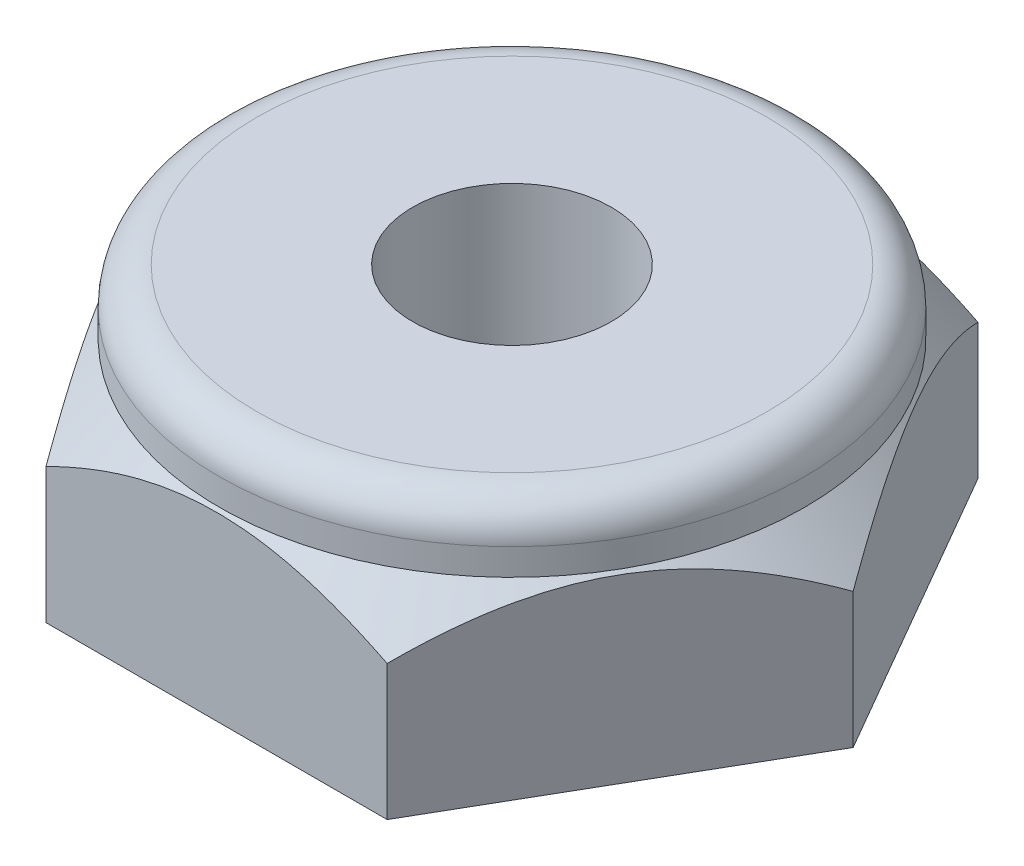
ISO-10303-21;
HEADER;
FILE_DESCRIPTION(('STEP AP214'),'2;1');
FILE_NAME('part.step','',(''),(''),'','','');
FILE_SCHEMA(('AUTOMOTIVE_DESIGN { 1 0 10303 214 1 1 1 1 }'));
ENDSEC;
DATA;
#1=APPLICATION_CONTEXT('core data for automotive mechanical design processes');
#2=APPLICATION_PROTOCOL_DEFINITION('international standard','automotive_design',2000,#1);
#3=PRODUCT_CONTEXT('',#1,'mechanical');
#4=PRODUCT('Part','Part','',(#3));
#5=PRODUCT_RELATED_PRODUCT_CATEGORY('part','',(#4));
#6=PRODUCT_DEFINITION_FORMATION('','',#4);
#7=PRODUCT_DEFINITION_CONTEXT('part definition',#1,'design');
#8=PRODUCT_DEFINITION('design','',#6,#7);
#9=PRODUCT_DEFINITION_SHAPE('','',#8);
#10=(LENGTH_UNIT() NAMED_UNIT(*) SI_UNIT(.MILLI.,.METRE.));
#11=(NAMED_UNIT(*) PLANE_ANGLE_UNIT() SI_UNIT($,.RADIAN.));
#12=(NAMED_UNIT(*) SI_UNIT($,.STERADIAN.) SOLID_ANGLE_UNIT());
#13=UNCERTAINTY_MEASURE_WITH_UNIT(LENGTH_MEASURE(1.E-05),#10,'distance_accuracy_value','');
#14=(GEOMETRIC_REPRESENTATION_CONTEXT(3) GLOBAL_UNCERTAINTY_ASSIGNED_CONTEXT((#13)) GLOBAL_UNIT_ASSIGNED_CONTEXT((#10,
#11,#12)) REPRESENTATION_CONTEXT('',''));
#15=CARTESIAN_POINT('',(0.,0.,0.));
#16=DIRECTION('',(0.,0.,1.));
#17=DIRECTION('',(1.,0.,0.));
#18=AXIS2_PLACEMENT_3D('',#15,#16,#17);
#19=CARTESIAN_POINT('',(-4.54605601959911,-3.302,0.));
#20=DIRECTION('',(-0.866025403784439,0.,0.5));
#21=DIRECTION('',(0.5,0.,0.866025403784439));
#22=AXIS2_PLACEMENT_3D('',#19,#20,#21);
#23=PLANE('',#22);
#24=CARTESIAN_POINT('',(-4.54617148965295,-1.50011547445315,-0.000199999999996562));
#25=CARTESIAN_POINT('',(-4.50708615861735,-1.46103413357023,0.0674977791843119));
#26=CARTESIAN_POINT('',(-4.46770173308911,-1.42315178723117,0.135713605226132));
#27=CARTESIAN_POINT('',(-4.38827308186812,-1.35015056154902,0.273288064717551));
#28=CARTESIAN_POINT('',(-4.34822851003329,-1.31503319158854,0.342647297702827));
#29=CARTESIAN_POINT('',(-4.2266400726266,-1.21407726664643,0.553244648904112));
#30=CARTESIAN_POINT('',(-4.1440628260123,-1.15306563669066,0.696272635589224));
#31=CARTESIAN_POINT('',(-3.97757147931389,-1.04858005372606,0.98464410709144));
#32=CARTESIAN_POINT('',(-3.89369943400899,-1.00484298136551,1.12991475089425));
#33=CARTESIAN_POINT('',(-3.72410331475854,-0.93745108995119,1.42366384620255));
#34=CARTESIAN_POINT('',(-3.63838443490816,-0.913745990599986,1.57213330127129));
#35=CARTESIAN_POINT('',(-3.49065141864676,-0.892358407810814,1.82801439139144));
#36=CARTESIAN_POINT('',(-3.42882762170213,-0.889193072578656,1.93509634881635));
#37=CARTESIAN_POINT('',(-3.30528037085692,-0.894528794508116,2.14908646441571));
#38=CARTESIAN_POINT('',(-3.2435569597247,-0.903033941378471,2.25599454851318));
#39=CARTESIAN_POINT('',(-3.12069497858448,-0.931225501079716,2.46879774216662));
#40=CARTESIAN_POINT('',(-3.05955714058954,-0.950924419546993,2.57469158383876));
#41=CARTESIAN_POINT('',(-2.9383314730354,-1.0004281955262,2.78466059922399));
#42=CARTESIAN_POINT('',(-2.87824356334123,-1.03023227819525,2.88873591173489));
#43=CARTESIAN_POINT('',(-2.77157288699713,-1.09155121481548,3.07349494284061));
#44=CARTESIAN_POINT('',(-2.72475395500278,-1.12145385882393,3.15458771181094));
#45=CARTESIAN_POINT('',(-2.63195657882758,-1.18607819930764,3.31531748215546));
#46=CARTESIAN_POINT('',(-2.58597816026704,-1.22080004240416,3.39495443915399));
#47=CARTESIAN_POINT('',(-2.49500666986816,-1.29428440135361,3.55252168256512));
#48=CARTESIAN_POINT('',(-2.45001101063402,-1.3330342109563,3.63045645047871));
#49=CARTESIAN_POINT('',(-2.36085296259835,-1.4140656570786,3.78488271958016));
#50=CARTESIAN_POINT('',(-2.31669008267055,-1.45634512672288,3.86137507142366));
#51=CARTESIAN_POINT('',(-2.27291253974572,-1.50011547445315,3.9372));
#52=B_SPLINE_CURVE_WITH_KNOTS('',3,(#24,#25,#26,#27,#28,#29,#30,#31,#32,#33,#34,#35,#36,#37,#38,
#39,#40,#41,#42,#43,#44,#45,#46,#47,#48,#49,#50,#51),.UNSPECIFIED.,.F.,.F.,(4,2,2,2,2,2,2,2,2,2,
2,2,2,4),(0.,0.262167191477977,0.524476520108971,1.0519274511668,1.57100223784716,
2.08877024272817,2.45931112472592,2.82998188922073,3.20106758206125,3.57212482725894,
3.86687633148112,4.16163680530821,4.45549415681849,4.74917241609622),.UNSPECIFIED.);
#53=CARTESIAN_POINT('',(-4.54605601959911,-1.5,0.));
#54=VERTEX_POINT('',#53);
#55=CARTESIAN_POINT('',(-2.27302800979954,-1.5,3.937));
#56=VERTEX_POINT('',#55);
#57=EDGE_CURVE('E151',#54,#56,#52,.T.);
#58=ORIENTED_EDGE('',*,*,#57,.F.);
#59=DIRECTION('',(0.,1.,0.));
#60=VECTOR('',#59,1.);
#61=CARTESIAN_POINT('',(-4.54605601959911,-3.302,0.));
#62=LINE('',#61,#60);
#63=CARTESIAN_POINT('',(-4.54605601959911,-3.302,0.));
#64=VERTEX_POINT('',#63);
#65=EDGE_CURVE('E38',#64,#54,#62,.T.);
#66=ORIENTED_EDGE('',*,*,#65,.F.);
#67=DIRECTION('',(0.5,0.,0.866025403784439));
#68=VECTOR('',#67,1.);
#69=CARTESIAN_POINT('',(-4.54605601959911,-3.302,0.));
#70=LINE('',#69,#68);
#71=CARTESIAN_POINT('',(-2.27302800979956,-3.302,3.937));
#72=VERTEX_POINT('',#71);
#73=EDGE_CURVE('E104',#64,#72,#70,.T.);
#74=ORIENTED_EDGE('',*,*,#73,.T.);
#75=DIRECTION('',(0.,1.,0.));
#76=VECTOR('',#75,1.);
#77=CARTESIAN_POINT('',(-2.27302800979956,-3.302,3.937));
#78=LINE('',#77,#76);
#79=EDGE_CURVE('E92',#72,#56,#78,.T.);
#80=ORIENTED_EDGE('',*,*,#79,.T.);
#81=EDGE_LOOP('',(#58,#66,#74,#80));
#82=FACE_BOUND('',#81,.T.);
#83=ADVANCED_FACE('F15',(#82),#23,.T.);
#84=CARTESIAN_POINT('',(-2.27302800979956,-3.302,3.937));
#85=DIRECTION('',(0.,0.,1.));
#86=DIRECTION('',(1.,0.,0.));
#87=AXIS2_PLACEMENT_3D('',#84,#85,#86);
#88=PLANE('',#87);
#89=CARTESIAN_POINT('',(-4.72869924271036,-3.10703796050632,3.937));
#90=CARTESIAN_POINT('',(-4.61439832842648,-3.01921658738196,3.937));
#91=CARTESIAN_POINT('',(-4.49947984677608,-2.9321863258603,3.937));
#92=CARTESIAN_POINT('',(-4.26815593701452,-2.76006895754731,3.937));
#93=CARTESIAN_POINT('',(-4.15175016213299,-2.67498231730659,3.937));
#94=CARTESIAN_POINT('',(-3.91634902967783,-2.50650756887895,3.937));
#95=CARTESIAN_POINT('',(-3.79734061971118,-2.42313763835376,3.937));
#96=CARTESIAN_POINT('',(-3.5573402479072,-2.2593132677911,3.937));
#97=CARTESIAN_POINT('',(-3.43634842371239,-2.17885862667558,3.937));
#98=CARTESIAN_POINT('',(-3.18435797162262,-2.01657490207025,3.937));
#99=CARTESIAN_POINT('',(-3.05320892657298,-1.93497820993293,3.937));
#100=CARTESIAN_POINT('',(-2.78783200324083,-1.77686992733175,3.937));
#101=CARTESIAN_POINT('',(-2.65360361397981,-1.70035918914884,3.937));
#102=CARTESIAN_POINT('',(-2.3820347180318,-1.55405375705132,3.937));
#103=CARTESIAN_POINT('',(-2.24470491862058,-1.4842393439705,3.937));
#104=CARTESIAN_POINT('',(-1.9661724107777,-1.35289068289784,3.937));
#105=CARTESIAN_POINT('',(-1.82497156227938,-1.2913525395016,3.937));
#106=CARTESIAN_POINT('',(-1.55236082825678,-1.18427038950648,3.937));
#107=CARTESIAN_POINT('',(-1.42133754131491,-1.1377521934529,3.937));
#108=CARTESIAN_POINT('',(-1.15596563248363,-1.05520472523351,3.937));
#109=CARTESIAN_POINT('',(-1.02161679828333,-1.01917612463224,3.937));
#110=CARTESIAN_POINT('',(-0.75272843540011,-0.960153457954507,3.937));
#111=CARTESIAN_POINT('',(-0.618241544500033,-0.936923611522538,3.937));
#112=CARTESIAN_POINT('',(-0.347613149841724,-0.903980880208376,3.937));
#113=CARTESIAN_POINT('',(-0.211471990703166,-0.894265227124783,3.937));
#114=CARTESIAN_POINT('',(0.0552021851988242,-0.889171113073084,3.937));
#115=CARTESIAN_POINT('',(0.185723853762298,-0.89319241040475,3.937));
#116=CARTESIAN_POINT('',(0.445741956370774,-0.913975585147723,3.937));
#117=CARTESIAN_POINT('',(0.575238295707913,-0.930738625934333,3.937));
#118=CARTESIAN_POINT('',(0.834462689792478,-0.976344734749414,3.937));
#119=CARTESIAN_POINT('',(0.964152682380901,-1.0054005262483,3.937));
#120=CARTESIAN_POINT('',(1.2206790388959,-1.07398458268704,3.937));
#121=CARTESIAN_POINT('',(1.34751557000222,-1.11351223235485,3.937));
#122=CARTESIAN_POINT('',(1.60561621698925,-1.20394244518904,3.937));
#123=CARTESIAN_POINT('',(1.73668878714197,-1.25538556537152,3.937));
#124=CARTESIAN_POINT('',(1.99546060527349,-1.36621659078581,3.937));
#125=CARTESIAN_POINT('',(2.12315829763097,-1.42560808582629,3.937));
#126=CARTESIAN_POINT('',(2.37578468112339,-1.5509271722604,3.937));
#127=CARTESIAN_POINT('',(2.50070329136841,-1.61687492056357,3.937));
#128=CARTESIAN_POINT('',(2.74767734817985,-1.75385486161387,3.937));
#129=CARTESIAN_POINT('',(2.86973323263917,-1.82488626992218,3.937));
#130=CARTESIAN_POINT('',(3.10538876246751,-1.96743065227491,3.937));
#131=CARTESIAN_POINT('',(3.2191082845364,-2.03874649223954,3.937));
#132=CARTESIAN_POINT('',(3.44459361298226,-2.18441165299389,3.937));
#133=CARTESIAN_POINT('',(3.55635927187606,-2.25876120137637,3.937));
#134=CARTESIAN_POINT('',(3.77729341673363,-2.40934690256648,3.937));
#135=CARTESIAN_POINT('',(3.88647555508483,-2.4855630970605,3.937));
#136=CARTESIAN_POINT('',(4.10334231800577,-2.64003700132819,3.937));
#137=CARTESIAN_POINT('',(4.21102734705313,-2.71829414259035,3.937));
#138=CARTESIAN_POINT('',(4.31808442632425,-2.79738663972974,3.937));
#139=B_SPLINE_CURVE_WITH_KNOTS('',3,(#89,#90,#91,#92,#93,#94,#95,#96,#97,#98,#99,#100,#101,#102,
#103,#104,#105,#106,#107,#108,#109,#110,#111,#112,#113,#114,#115,#116,#117,#118,#119,#120,#121,
#122,#123,#124,#125,#126,#127,#128,#129,#130,#131,#132,#133,#134,#135,#136,#137,#138),
.UNSPECIFIED.,.F.,.F.,(4,2,2,2,2,2,2,2,2,2,2,2,2,2,2,2,2,2,2,2,2,2,2,2,4),(0.,0.432437893410808,
0.864978521830696,1.30085749750716,1.73670635158343,2.1999966047261,2.66336429923368,
3.12532265369613,3.58706281084548,4.00381124177474,4.42058634789466,4.8294023243037,
5.23813454790073,5.62923961519657,6.02038039633653,6.41858605509114,6.81676832253387,
7.23886325341926,7.66114946693152,8.08477667962884,8.50833866449401,8.91097654470721,
9.31364468707772,9.71307747597712,10.1124001656956),.UNSPECIFIED.);
#140=CARTESIAN_POINT('',(2.27302800979957,-1.5,3.93699999999999));
#141=VERTEX_POINT('',#140);
#142=EDGE_CURVE('E73',#56,#141,#139,.T.);
#143=ORIENTED_EDGE('',*,*,#142,.F.);
#144=ORIENTED_EDGE('',*,*,#79,.F.);
#145=DIRECTION('',(1.,0.,0.));
#146=VECTOR('',#145,1.);
#147=CARTESIAN_POINT('',(-2.27302800979956,-3.302,3.937));
#148=LINE('',#147,#146);
#149=CARTESIAN_POINT('',(2.27302800979956,-3.302,3.937));
#150=VERTEX_POINT('',#149);
#151=EDGE_CURVE('E186',#72,#150,#148,.T.);
#152=ORIENTED_EDGE('',*,*,#151,.T.);
#153=DIRECTION('',(0.,1.,0.));
#154=VECTOR('',#153,1.);
#155=CARTESIAN_POINT('',(2.27302800979956,-3.302,3.937));
#156=LINE('',#155,#154);
#157=EDGE_CURVE('E90',#150,#141,#156,.T.);
#158=ORIENTED_EDGE('',*,*,#157,.T.);
#159=EDGE_LOOP('',(#143,#144,#152,#158));
#160=FACE_BOUND('',#159,.T.);
#161=ADVANCED_FACE('F157',(#160),#88,.T.);
#162=CARTESIAN_POINT('',(2.27302800979956,-3.302,3.937));
#163=DIRECTION('',(0.866025403784439,0.,0.499999999999999));
#164=DIRECTION('',(0.499999999999999,0.,-0.866025403784439));
#165=AXIS2_PLACEMENT_3D('',#162,#163,#164);
#166=PLANE('',#165);
#167=CARTESIAN_POINT('',(2.27291253974572,-1.50011547445315,3.9372));
#168=CARTESIAN_POINT('',(2.31199787078132,-1.46103413357023,3.86950222081569));
#169=CARTESIAN_POINT('',(2.35138229630956,-1.42315178723117,3.80128639477387));
#170=CARTESIAN_POINT('',(2.43081094753055,-1.35015056154902,3.66371193528245));
#171=CARTESIAN_POINT('',(2.47085551936538,-1.31503319158854,3.59435270229718));
#172=CARTESIAN_POINT('',(2.59244395677207,-1.21407726664643,3.38375535109589));
#173=CARTESIAN_POINT('',(2.67502120338637,-1.15306563669066,3.24072736441078));
#174=CARTESIAN_POINT('',(2.84151255008478,-1.04858005372605,2.95235589290856));
#175=CARTESIAN_POINT('',(2.92538459538968,-1.00484298136551,2.80708524910575));
#176=CARTESIAN_POINT('',(3.09498071464014,-0.937451089951187,2.51333615379745));
#177=CARTESIAN_POINT('',(3.18069959449052,-0.913745990599983,2.3648666987287));
#178=CARTESIAN_POINT('',(3.32843261075192,-0.892358407810811,2.10898560860856));
#179=CARTESIAN_POINT('',(3.39025640769654,-0.889193072578653,2.00190365118365));
#180=CARTESIAN_POINT('',(3.51380365854175,-0.894528794508112,1.78791353558428));
#181=CARTESIAN_POINT('',(3.57552706967397,-0.903033941378467,1.68100545148682));
#182=CARTESIAN_POINT('',(3.6983890508142,-0.931225501079712,1.46820225783338));
#183=CARTESIAN_POINT('',(3.75952688880913,-0.95092441954699,1.36230841616124));
#184=CARTESIAN_POINT('',(3.88075255636327,-1.00042819552619,1.15233940077601));
#185=CARTESIAN_POINT('',(3.94084046605744,-1.03023227819525,1.0482640882651));
#186=CARTESIAN_POINT('',(4.04751114240154,-1.09155121481548,0.863505057159388));
#187=CARTESIAN_POINT('',(4.09433007439589,-1.12145385882393,0.782412288189059));
#188=CARTESIAN_POINT('',(4.18712745057109,-1.18607819930764,0.621682517844535));
#189=CARTESIAN_POINT('',(4.23310586913163,-1.22080004240415,0.542045560846008));
#190=CARTESIAN_POINT('',(4.32407735953051,-1.2942844013536,0.384478317434878));
#191=CARTESIAN_POINT('',(4.36907301876465,-1.33303421095629,0.306543549521292));
#192=CARTESIAN_POINT('',(4.45823106680032,-1.41406565707859,0.152117280419844));
#193=CARTESIAN_POINT('',(4.50239394672812,-1.45634512672288,0.0756249285763411));
#194=CARTESIAN_POINT('',(4.54617148965295,-1.50011547445314,-0.000199999999997459));
#195=B_SPLINE_CURVE_WITH_KNOTS('',3,(#167,#168,#169,#170,#171,#172,#173,#174,#175,#176,#177,
#178,#179,#180,#181,#182,#183,#184,#185,#186,#187,#188,#189,#190,#191,#192,#193,#194),
.UNSPECIFIED.,.F.,.F.,(4,2,2,2,2,2,2,2,2,2,2,2,2,4),(0.,0.262167191477979,0.524476520108974,
1.0519274511668,1.57100223784717,2.08877024272818,2.45931112472593,2.82998188922074,
3.20106758206126,3.57212482725895,3.86687633148112,4.16163680530822,4.45549415681849,
4.74917241609622),.UNSPECIFIED.);
#196=CARTESIAN_POINT('',(4.54605601959911,-1.5,0.));
#197=VERTEX_POINT('',#196);
#198=EDGE_CURVE('E68',#141,#197,#195,.T.);
#199=ORIENTED_EDGE('',*,*,#198,.F.);
#200=ORIENTED_EDGE('',*,*,#157,.F.);
#201=DIRECTION('',(0.499999999999999,0.,-0.866025403784439));
#202=VECTOR('',#201,1.);
#203=CARTESIAN_POINT('',(2.27302800979956,-3.302,3.937));
#204=LINE('',#203,#202);
#205=CARTESIAN_POINT('',(4.54605601959911,-3.302,0.));
#206=VERTEX_POINT('',#205);
#207=EDGE_CURVE('E88',#150,#206,#204,.T.);
#208=ORIENTED_EDGE('',*,*,#207,.T.);
#209=DIRECTION('',(0.,1.,0.));
#210=VECTOR('',#209,1.);
#211=CARTESIAN_POINT('',(4.54605601959911,-3.302,0.));
#212=LINE('',#211,#210);
#213=EDGE_CURVE('E82',#206,#197,#212,.T.);
#214=ORIENTED_EDGE('',*,*,#213,.T.);
#215=EDGE_LOOP('',(#199,#200,#208,#214));
#216=FACE_BOUND('',#215,.T.);
#217=ADVANCED_FACE('F86',(#216),#166,.T.);
#218=CARTESIAN_POINT('',(4.54605601959911,-3.302,0.));
#219=DIRECTION('',(0.866025403784439,0.,-0.499999999999999));
#220=DIRECTION('',(-0.499999999999999,0.,-0.866025403784439));
#221=AXIS2_PLACEMENT_3D('',#218,#219,#220);
#222=PLANE('',#221);
#223=CARTESIAN_POINT('',(4.54617148965295,-1.50011547445314,0.000200000000002567));
#224=CARTESIAN_POINT('',(4.50708615861735,-1.46103413357022,-0.0674977791843063));
#225=CARTESIAN_POINT('',(4.46770173308911,-1.42315178723116,-0.135713605226126));
#226=CARTESIAN_POINT('',(4.38827308186812,-1.35015056154901,-0.273288064717545));
#227=CARTESIAN_POINT('',(4.34822851003329,-1.31503319158853,-0.342647297702821));
#228=CARTESIAN_POINT('',(4.2266400726266,-1.21407726664643,-0.553244648904107));
#229=CARTESIAN_POINT('',(4.1440628260123,-1.15306563669065,-0.696272635589218));
#230=CARTESIAN_POINT('',(3.97757147931389,-1.04858005372605,-0.984644107091434));
#231=CARTESIAN_POINT('',(3.89369943400899,-1.0048429813655,-1.12991475089424));
#232=CARTESIAN_POINT('',(3.72410331475854,-0.937451089951184,-1.42366384620254));
#233=CARTESIAN_POINT('',(3.63838443490816,-0.91374599059998,-1.57213330127129));
#234=CARTESIAN_POINT('',(3.49065141864676,-0.892358407810808,-1.82801439139143));
#235=CARTESIAN_POINT('',(3.42882762170214,-0.889193072578649,-1.93509634881634));
#236=CARTESIAN_POINT('',(3.30528037085692,-0.894528794508109,-2.14908646441571));
#237=CARTESIAN_POINT('',(3.24355695972471,-0.903033941378465,-2.25599454851317));
#238=CARTESIAN_POINT('',(3.12069497858448,-0.93122550107971,-2.46879774216661));
#239=CARTESIAN_POINT('',(3.05955714058955,-0.950924419546987,-2.57469158383875));
#240=CARTESIAN_POINT('',(2.9383314730354,-1.00042819552619,-2.78466059922398));
#241=CARTESIAN_POINT('',(2.87824356334124,-1.03023227819525,-2.88873591173489));
#242=CARTESIAN_POINT('',(2.77157288699714,-1.09155121481547,-3.0734949428406));
#243=CARTESIAN_POINT('',(2.72475395500279,-1.12145385882393,-3.15458771181093));
#244=CARTESIAN_POINT('',(2.63195657882759,-1.18607819930764,-3.31531748215546));
#245=CARTESIAN_POINT('',(2.58597816026705,-1.22080004240415,-3.39495443915399));
#246=CARTESIAN_POINT('',(2.49500666986816,-1.2942844013536,-3.55252168256512));
#247=CARTESIAN_POINT('',(2.45001101063402,-1.33303421095629,-3.6304564504787));
#248=CARTESIAN_POINT('',(2.36085296259835,-1.41406565707859,-3.78488271958015));
#249=CARTESIAN_POINT('',(2.31669008267056,-1.45634512672288,-3.86137507142366));
#250=CARTESIAN_POINT('',(2.27291253974572,-1.50011547445315,-3.9372));
#251=B_SPLINE_CURVE_WITH_KNOTS('',3,(#223,#224,#225,#226,#227,#228,#229,#230,#231,#232,#233,
#234,#235,#236,#237,#238,#239,#240,#241,#242,#243,#244,#245,#246,#247,#248,#249,#250),
.UNSPECIFIED.,.F.,.F.,(4,2,2,2,2,2,2,2,2,2,2,2,2,4),(0.,0.262167191477977,0.524476520108971,
1.05192745116679,1.57100223784716,2.08877024272817,2.45931112472592,2.82998188922073,
3.20106758206125,3.57212482725893,3.86687633148111,4.16163680530821,4.45549415681849,
4.74917241609622),.UNSPECIFIED.);
#252=CARTESIAN_POINT('',(2.27302800979956,-1.5,-3.937));
#253=VERTEX_POINT('',#252);
#254=EDGE_CURVE('E71',#197,#253,#251,.T.);
#255=ORIENTED_EDGE('',*,*,#254,.F.);
#256=ORIENTED_EDGE('',*,*,#213,.F.);
#257=DIRECTION('',(-0.499999999999999,0.,-0.866025403784439));
#258=VECTOR('',#257,1.);
#259=CARTESIAN_POINT('',(4.54605601959911,-3.302,0.));
#260=LINE('',#259,#258);
#261=CARTESIAN_POINT('',(2.27302800979956,-3.302,-3.937));
#262=VERTEX_POINT('',#261);
#263=EDGE_CURVE('E190',#206,#262,#260,.T.);
#264=ORIENTED_EDGE('',*,*,#263,.T.);
#265=DIRECTION('',(0.,1.,0.));
#266=VECTOR('',#265,1.);
#267=CARTESIAN_POINT('',(2.27302800979956,-3.302,-3.937));
#268=LINE('',#267,#266);
#269=EDGE_CURVE('E84',#262,#253,#268,.T.);
#270=ORIENTED_EDGE('',*,*,#269,.T.);
#271=EDGE_LOOP('',(#255,#256,#264,#270));
#272=FACE_BOUND('',#271,.T.);
#273=ADVANCED_FACE('F80',(#272),#222,.T.);
#274=CARTESIAN_POINT('',(2.27302800979956,-3.302,-3.937));
#275=DIRECTION('',(0.,0.,-1.));
#276=DIRECTION('',(-1.,0.,0.));
#277=AXIS2_PLACEMENT_3D('',#274,#275,#276);
#278=PLANE('',#277);
#279=CARTESIAN_POINT('',(-4.72869924271036,-3.10703796050632,-3.937));
#280=CARTESIAN_POINT('',(-4.61439832842648,-3.01921658738196,-3.937));
#281=CARTESIAN_POINT('',(-4.49947984677608,-2.93218632586029,-3.937));
#282=CARTESIAN_POINT('',(-4.26815593701452,-2.76006895754731,-3.937));
#283=CARTESIAN_POINT('',(-4.15175016213299,-2.67498231730659,-3.937));
#284=CARTESIAN_POINT('',(-3.91634902967783,-2.50650756887895,-3.937));
#285=CARTESIAN_POINT('',(-3.79734061971118,-2.42313763835375,-3.937));
#286=CARTESIAN_POINT('',(-3.5573402479072,-2.2593132677911,-3.937));
#287=CARTESIAN_POINT('',(-3.43634842371239,-2.17885862667558,-3.937));
#288=CARTESIAN_POINT('',(-3.18435797162262,-2.01657490207024,-3.937));
#289=CARTESIAN_POINT('',(-3.05320892657298,-1.93497820993293,-3.937));
#290=CARTESIAN_POINT('',(-2.78783200324083,-1.77686992733175,-3.937));
#291=CARTESIAN_POINT('',(-2.65360361397981,-1.70035918914884,-3.937));
#292=CARTESIAN_POINT('',(-2.3820347180318,-1.55405375705131,-3.937));
#293=CARTESIAN_POINT('',(-2.24470491862058,-1.48423934397049,-3.937));
#294=CARTESIAN_POINT('',(-1.9661724107777,-1.35289068289783,-3.937));
#295=CARTESIAN_POINT('',(-1.82497156227938,-1.2913525395016,-3.937));
#296=CARTESIAN_POINT('',(-1.55236082825679,-1.18427038950647,-3.937));
#297=CARTESIAN_POINT('',(-1.42133754131492,-1.1377521934529,-3.937));
#298=CARTESIAN_POINT('',(-1.15596563248364,-1.05520472523351,-3.937));
#299=CARTESIAN_POINT('',(-1.02161679828333,-1.01917612463223,-3.937));
#300=CARTESIAN_POINT('',(-0.752728435400113,-0.960153457954501,-3.937));
#301=CARTESIAN_POINT('',(-0.618241544500036,-0.936923611522532,-3.937));
#302=CARTESIAN_POINT('',(-0.347613149841727,-0.903980880208369,-3.937));
#303=CARTESIAN_POINT('',(-0.211471990703169,-0.894265227124776,-3.937));
#304=CARTESIAN_POINT('',(0.0552021851988214,-0.889171113073077,-3.937));
#305=CARTESIAN_POINT('',(0.185723853762295,-0.893192410404743,-3.937));
#306=CARTESIAN_POINT('',(0.445741956370772,-0.913975585147715,-3.937));
#307=CARTESIAN_POINT('',(0.575238295707911,-0.930738625934325,-3.937));
#308=CARTESIAN_POINT('',(0.834462689792476,-0.976344734749406,-3.937));
#309=CARTESIAN_POINT('',(0.964152682380899,-1.00540052624829,-3.937));
#310=CARTESIAN_POINT('',(1.2206790388959,-1.07398458268704,-3.937));
#311=CARTESIAN_POINT('',(1.34751557000221,-1.11351223235484,-3.937));
#312=CARTESIAN_POINT('',(1.60561621698924,-1.20394244518903,-3.937));
#313=CARTESIAN_POINT('',(1.73668878714197,-1.25538556537151,-3.937));
#314=CARTESIAN_POINT('',(1.99546060527349,-1.36621659078581,-3.937));
#315=CARTESIAN_POINT('',(2.12315829763096,-1.42560808582628,-3.937));
#316=CARTESIAN_POINT('',(2.37578468112338,-1.55092717226039,-3.937));
#317=CARTESIAN_POINT('',(2.5007032913684,-1.61687492056356,-3.937));
#318=CARTESIAN_POINT('',(2.74767734817984,-1.75385486161386,-3.937));
#319=CARTESIAN_POINT('',(2.86973323263917,-1.82488626992217,-3.937));
#320=CARTESIAN_POINT('',(3.10538876246751,-1.9674306522749,-3.937));
#321=CARTESIAN_POINT('',(3.2191082845364,-2.03874649223953,-3.937));
#322=CARTESIAN_POINT('',(3.44459361298225,-2.18441165299388,-3.937));
#323=CARTESIAN_POINT('',(3.55635927187605,-2.25876120137636,-3.937));
#324=CARTESIAN_POINT('',(3.77729341673363,-2.40934690256647,-3.937));
#325=CARTESIAN_POINT('',(3.88647555508482,-2.48556309706049,-3.937));
#326=CARTESIAN_POINT('',(4.10334231800576,-2.64003700132818,-3.937));
#327=CARTESIAN_POINT('',(4.21102734705312,-2.71829414259034,-3.937));
#328=CARTESIAN_POINT('',(4.31808442632425,-2.79738663972973,-3.937));
#329=B_SPLINE_CURVE_WITH_KNOTS('',3,(#279,#280,#281,#282,#283,#284,#285,#286,#287,#288,#289,
#290,#291,#292,#293,#294,#295,#296,#297,#298,#299,#300,#301,#302,#303,#304,#305,#306,#307,#308,
#309,#310,#311,#312,#313,#314,#315,#316,#317,#318,#319,#320,#321,#322,#323,#324,#325,#326,#327,
#328),.UNSPECIFIED.,.F.,.F.,(4,2,2,2,2,2,2,2,2,2,2,2,2,2,2,2,2,2,2,2,2,2,2,2,4),(0.,
0.432437893410809,0.864978521830697,1.30085749750717,1.73670635158343,2.19999660472611,
2.66336429923369,3.12532265369613,3.58706281084548,4.00381124177474,4.42058634789466,
4.8294023243037,5.23813454790074,5.62923961519657,6.02038039633653,6.41858605509115,
6.81676832253387,7.23886325341926,7.66114946693152,8.08477667962884,8.50833866449401,
8.91097654470721,9.31364468707771,9.71307747597712,10.1124001656956),.UNSPECIFIED.);
#330=CARTESIAN_POINT('',(-2.27302800979956,-1.5,-3.937));
#331=VERTEX_POINT('',#330);
#332=EDGE_CURVE('E30',#253,#331,#329,.F.);
#333=ORIENTED_EDGE('',*,*,#332,.F.);
#334=ORIENTED_EDGE('',*,*,#269,.F.);
#335=DIRECTION('',(-1.,0.,0.));
#336=VECTOR('',#335,1.);
#337=CARTESIAN_POINT('',(2.27302800979956,-3.302,-3.937));
#338=LINE('',#337,#336);
#339=CARTESIAN_POINT('',(-2.27302800979956,-3.302,-3.937));
#340=VERTEX_POINT('',#339);
#341=EDGE_CURVE('E183',#262,#340,#338,.T.);
#342=ORIENTED_EDGE('',*,*,#341,.T.);
#343=DIRECTION('',(0.,1.,0.));
#344=VECTOR('',#343,1.);
#345=CARTESIAN_POINT('',(-2.27302800979956,-3.302,-3.937));
#346=LINE('',#345,#344);
#347=EDGE_CURVE('E94',#340,#331,#346,.T.);
#348=ORIENTED_EDGE('',*,*,#347,.T.);
#349=EDGE_LOOP('',(#333,#334,#342,#348));
#350=FACE_BOUND('',#349,.T.);
#351=ADVANCED_FACE('F165',(#350),#278,.T.);
#352=CARTESIAN_POINT('',(-2.27302800979956,-3.302,-3.937));
#353=DIRECTION('',(-0.866025403784439,0.,-0.5));
#354=DIRECTION('',(-0.5,0.,0.866025403784439));
#355=AXIS2_PLACEMENT_3D('',#352,#353,#354);
#356=PLANE('',#355);
#357=CARTESIAN_POINT('',(-2.27291253974572,-1.50011547445315,-3.9372));
#358=CARTESIAN_POINT('',(-2.31199787078132,-1.46103413357023,-3.86950222081569));
#359=CARTESIAN_POINT('',(-2.35138229630956,-1.42315178723116,-3.80128639477387));
#360=CARTESIAN_POINT('',(-2.43081094753054,-1.35015056154902,-3.66371193528245));
#361=CARTESIAN_POINT('',(-2.47085551936538,-1.31503319158853,-3.59435270229717));
#362=CARTESIAN_POINT('',(-2.59244395677206,-1.21407726664643,-3.38375535109589));
#363=CARTESIAN_POINT('',(-2.67502120338636,-1.15306563669065,-3.24072736441078));
#364=CARTESIAN_POINT('',(-2.84151255008477,-1.04858005372605,-2.95235589290856));
#365=CARTESIAN_POINT('',(-2.92538459538968,-1.00484298136551,-2.80708524910575));
#366=CARTESIAN_POINT('',(-3.09498071464013,-0.937451089951187,-2.51333615379745));
#367=CARTESIAN_POINT('',(-3.18069959449051,-0.913745990599983,-2.36486669872871));
#368=CARTESIAN_POINT('',(-3.32843261075191,-0.89235840781081,-2.10898560860856));
#369=CARTESIAN_POINT('',(-3.39025640769653,-0.889193072578652,-2.00190365118365));
#370=CARTESIAN_POINT('',(-3.51380365854175,-0.894528794508112,-1.78791353558429));
#371=CARTESIAN_POINT('',(-3.57552706967396,-0.903033941378467,-1.68100545148682));
#372=CARTESIAN_POINT('',(-3.69838905081419,-0.931225501079712,-1.46820225783338));
#373=CARTESIAN_POINT('',(-3.75952688880912,-0.950924419546989,-1.36230841616125));
#374=CARTESIAN_POINT('',(-3.88075255636327,-1.00042819552619,-1.15233940077601));
#375=CARTESIAN_POINT('',(-3.94084046605743,-1.03023227819525,-1.04826408826511));
#376=CARTESIAN_POINT('',(-4.04751114240153,-1.09155121481548,-0.863505057159392));
#377=CARTESIAN_POINT('',(-4.09433007439588,-1.12145385882393,-0.782412288189062));
#378=CARTESIAN_POINT('',(-4.18712745057108,-1.18607819930764,-0.621682517844536));
#379=CARTESIAN_POINT('',(-4.23310586913162,-1.22080004240415,-0.542045560846009));
#380=CARTESIAN_POINT('',(-4.32407735953051,-1.2942844013536,-0.384478317434877));
#381=CARTESIAN_POINT('',(-4.36907301876465,-1.3330342109563,-0.30654354952129));
#382=CARTESIAN_POINT('',(-4.45823106680032,-1.4140656570786,-0.15211728041984));
#383=CARTESIAN_POINT('',(-4.50239394672812,-1.45634512672288,-0.0756249285763366));
#384=CARTESIAN_POINT('',(-4.54617148965295,-1.50011547445315,0.000200000000002838));
#385=B_SPLINE_CURVE_WITH_KNOTS('',3,(#357,#358,#359,#360,#361,#362,#363,#364,#365,#366,#367,
#368,#369,#370,#371,#372,#373,#374,#375,#376,#377,#378,#379,#380,#381,#382,#383,#384),
.UNSPECIFIED.,.F.,.F.,(4,2,2,2,2,2,2,2,2,2,2,2,2,4),(0.,0.262167191477977,0.524476520108971,
1.05192745116679,1.57100223784716,2.08877024272817,2.45931112472592,2.82998188922073,
3.20106758206125,3.57212482725893,3.86687633148111,4.16163680530821,4.45549415681849,
4.74917241609622),.UNSPECIFIED.);
#386=EDGE_CURVE('E100',#331,#54,#385,.T.);
#387=ORIENTED_EDGE('',*,*,#386,.F.);
#388=ORIENTED_EDGE('',*,*,#347,.F.);
#389=DIRECTION('',(-0.5,0.,0.866025403784439));
#390=VECTOR('',#389,1.);
#391=CARTESIAN_POINT('',(-2.27302800979956,-3.302,-3.937));
#392=LINE('',#391,#390);
#393=EDGE_CURVE('E180',#340,#64,#392,.T.);
#394=ORIENTED_EDGE('',*,*,#393,.T.);
#395=ORIENTED_EDGE('',*,*,#65,.T.);
#396=EDGE_LOOP('',(#387,#388,#394,#395));
#397=FACE_BOUND('',#396,.T.);
#398=ADVANCED_FACE('F112',(#397),#356,.T.);
#399=CARTESIAN_POINT('',(-2.27302800979956,-3.302,3.937));
#400=DIRECTION('',(0.,1.,0.));
#401=DIRECTION('',(0.,0.,1.));
#402=AXIS2_PLACEMENT_3D('',#399,#400,#401);
#403=PLANE('',#402);
#404=CARTESIAN_POINT('',(0.,-3.302,0.));
#405=DIRECTION('',(0.,1.,0.));
#406=DIRECTION('',(0.,0.,-1.));
#407=AXIS2_PLACEMENT_3D('',#404,#405,#406);
#408=CIRCLE('',#407,1.32334);
#409=CARTESIAN_POINT('',(0.,-3.302,-1.32334));
#410=VERTEX_POINT('',#409);
#411=EDGE_CURVE('E105',#410,#410,#408,.T.);
#412=ORIENTED_EDGE('',*,*,#411,.T.);
#413=EDGE_LOOP('',(#412));
#414=FACE_BOUND('',#413,.T.);
#415=ORIENTED_EDGE('',*,*,#73,.F.);
#416=ORIENTED_EDGE('',*,*,#393,.F.);
#417=ORIENTED_EDGE('',*,*,#341,.F.);
#418=ORIENTED_EDGE('',*,*,#263,.F.);
#419=ORIENTED_EDGE('',*,*,#207,.F.);
#420=ORIENTED_EDGE('',*,*,#151,.F.);
#421=EDGE_LOOP('',(#415,#416,#417,#418,#419,#420));
#422=FACE_BOUND('',#421,.T.);
#423=ADVANCED_FACE('F173',(#414,#422),#403,.F.);
#424=CARTESIAN_POINT('',(-2.27302800979956,0.,3.937));
#425=DIRECTION('',(0.,1.,0.));
#426=DIRECTION('',(0.,0.,1.));
#427=AXIS2_PLACEMENT_3D('',#424,#425,#426);
#428=PLANE('',#427);
#429=CARTESIAN_POINT('',(0.,0.,0.));
#430=DIRECTION('',(0.,1.,0.));
#431=DIRECTION('',(0.,0.,1.));
#432=AXIS2_PLACEMENT_3D('',#429,#430,#431);
#433=CIRCLE('',#432,3.4);
#434=CARTESIAN_POINT('',(0.,0.,3.4));
#435=VERTEX_POINT('',#434);
#436=EDGE_CURVE('E10',#435,#435,#433,.T.);
#437=ORIENTED_EDGE('',*,*,#436,.T.);
#438=EDGE_LOOP('',(#437));
#439=FACE_BOUND('',#438,.T.);
#440=CARTESIAN_POINT('',(0.,0.,0.));
#441=DIRECTION('',(0.,1.,0.));
#442=DIRECTION('',(0.,0.,1.));
#443=AXIS2_PLACEMENT_3D('',#440,#441,#442);
#444=CIRCLE('',#443,1.32334);
#445=CARTESIAN_POINT('',(0.,0.,-1.32334));
#446=VERTEX_POINT('',#445);
#447=EDGE_CURVE('E101',#446,#446,#444,.T.);
#448=ORIENTED_EDGE('',*,*,#447,.F.);
#449=EDGE_LOOP('',(#448));
#450=FACE_BOUND('',#449,.T.);
#451=ADVANCED_FACE('F201',(#439,#450),#428,.T.);
#452=CARTESIAN_POINT('',(0.,-3.302,0.));
#453=DIRECTION('',(0.,1.,0.));
#454=DIRECTION('',(0.,0.,-1.));
#455=AXIS2_PLACEMENT_3D('',#452,#453,#454);
#456=CYLINDRICAL_SURFACE('',#455,1.32334);
#457=CARTESIAN_POINT('',(0.,0.,-1.32334));
#458=CARTESIAN_POINT('',(0.,-0.0343958333333333,-1.32334));
#459=CARTESIAN_POINT('',(0.,-0.0687916666666667,-1.32334));
#460=CARTESIAN_POINT('',(0.,-0.137583333333333,-1.32334));
#461=CARTESIAN_POINT('',(0.,-0.171979166666667,-1.32334));
#462=CARTESIAN_POINT('',(0.,-0.240770833333333,-1.32334));
#463=CARTESIAN_POINT('',(0.,-0.275166666666667,-1.32334));
#464=CARTESIAN_POINT('',(0.,-0.343958333333333,-1.32334));
#465=CARTESIAN_POINT('',(0.,-0.378354166666667,-1.32334));
#466=CARTESIAN_POINT('',(0.,-0.447145833333333,-1.32334));
#467=CARTESIAN_POINT('',(0.,-0.481541666666667,-1.32334));
#468=CARTESIAN_POINT('',(0.,-0.550333333333333,-1.32334));
#469=CARTESIAN_POINT('',(0.,-0.584729166666667,-1.32334));
#470=CARTESIAN_POINT('',(0.,-0.653520833333333,-1.32334));
#471=CARTESIAN_POINT('',(0.,-0.687916666666667,-1.32334));
#472=CARTESIAN_POINT('',(0.,-0.756708333333334,-1.32334));
#473=CARTESIAN_POINT('',(0.,-0.791104166666667,-1.32334));
#474=CARTESIAN_POINT('',(0.,-0.859895833333334,-1.32334));
#475=CARTESIAN_POINT('',(0.,-0.894291666666667,-1.32334));
#476=CARTESIAN_POINT('',(0.,-0.963083333333334,-1.32334));
#477=CARTESIAN_POINT('',(0.,-0.997479166666667,-1.32334));
#478=CARTESIAN_POINT('',(0.,-1.06627083333333,-1.32334));
#479=CARTESIAN_POINT('',(0.,-1.10066666666667,-1.32334));
#480=CARTESIAN_POINT('',(0.,-1.16945833333333,-1.32334));
#481=CARTESIAN_POINT('',(0.,-1.20385416666667,-1.32334));
#482=CARTESIAN_POINT('',(0.,-1.27264583333333,-1.32334));
#483=CARTESIAN_POINT('',(0.,-1.30704166666667,-1.32334));
#484=CARTESIAN_POINT('',(0.,-1.37583333333333,-1.32334));
#485=CARTESIAN_POINT('',(0.,-1.41022916666667,-1.32334));
#486=CARTESIAN_POINT('',(0.,-1.47902083333333,-1.32334));
#487=CARTESIAN_POINT('',(0.,-1.51341666666667,-1.32334));
#488=CARTESIAN_POINT('',(0.,-1.58220833333333,-1.32334));
#489=CARTESIAN_POINT('',(0.,-1.61660416666667,-1.32334));
#490=CARTESIAN_POINT('',(0.,-1.68539583333333,-1.32334));
#491=CARTESIAN_POINT('',(0.,-1.71979166666667,-1.32334));
#492=CARTESIAN_POINT('',(0.,-1.78858333333333,-1.32334));
#493=CARTESIAN_POINT('',(0.,-1.82297916666667,-1.32334));
#494=CARTESIAN_POINT('',(0.,-1.89177083333333,-1.32334));
#495=CARTESIAN_POINT('',(0.,-1.92616666666667,-1.32334));
#496=CARTESIAN_POINT('',(0.,-1.99495833333333,-1.32334));
#497=CARTESIAN_POINT('',(0.,-2.02935416666667,-1.32334));
#498=CARTESIAN_POINT('',(0.,-2.09814583333333,-1.32334));
#499=CARTESIAN_POINT('',(0.,-2.13254166666667,-1.32334));
#500=CARTESIAN_POINT('',(0.,-2.20133333333333,-1.32334));
#501=CARTESIAN_POINT('',(0.,-2.23572916666667,-1.32334));
#502=CARTESIAN_POINT('',(0.,-2.30452083333333,-1.32334));
#503=CARTESIAN_POINT('',(0.,-2.33891666666667,-1.32334));
#504=CARTESIAN_POINT('',(0.,-2.40770833333333,-1.32334));
#505=CARTESIAN_POINT('',(0.,-2.44210416666667,-1.32334));
#506=CARTESIAN_POINT('',(0.,-2.51089583333333,-1.32334));
#507=CARTESIAN_POINT('',(0.,-2.54529166666667,-1.32334));
#508=CARTESIAN_POINT('',(0.,-2.61408333333333,-1.32334));
#509=CARTESIAN_POINT('',(0.,-2.64847916666667,-1.32334));
#510=CARTESIAN_POINT('',(0.,-2.71727083333333,-1.32334));
#511=CARTESIAN_POINT('',(0.,-2.75166666666667,-1.32334));
#512=CARTESIAN_POINT('',(0.,-2.82045833333333,-1.32334));
#513=CARTESIAN_POINT('',(0.,-2.85485416666667,-1.32334));
#514=CARTESIAN_POINT('',(0.,-2.92364583333333,-1.32334));
#515=CARTESIAN_POINT('',(0.,-2.95804166666667,-1.32334));
#516=CARTESIAN_POINT('',(0.,-3.02683333333333,-1.32334));
#517=CARTESIAN_POINT('',(0.,-3.06122916666667,-1.32334));
#518=CARTESIAN_POINT('',(0.,-3.13002083333333,-1.32334));
#519=CARTESIAN_POINT('',(0.,-3.16441666666667,-1.32334));
#520=CARTESIAN_POINT('',(0.,-3.23320833333333,-1.32334));
#521=CARTESIAN_POINT('',(0.,-3.26760416666667,-1.32334));
#522=CARTESIAN_POINT('',(0.,-3.302,-1.32334));
#523=B_SPLINE_CURVE_WITH_KNOTS('',3,(#457,#458,#459,#460,#461,#462,#463,#464,#465,#466,#467,
#468,#469,#470,#471,#472,#473,#474,#475,#476,#477,#478,#479,#480,#481,#482,#483,#484,#485,#486,
#487,#488,#489,#490,#491,#492,#493,#494,#495,#496,#497,#498,#499,#500,#501,#502,#503,#504,#505,
#506,#507,#508,#509,#510,#511,#512,#513,#514,#515,#516,#517,#518,#519,#520,#521,#522),
.UNSPECIFIED.,.F.,.F.,(4,2,2,2,2,2,2,2,2,2,2,2,2,2,2,2,2,2,2,2,2,2,2,2,2,2,2,2,2,2,2,2,4),(0.,
0.1031875,0.206375,0.3095625,0.41275,0.5159375,0.619125,0.7223125,0.8255,0.9286875,1.031875,
1.1350625,1.23825,1.3414375,1.444625,1.5478125,1.651,1.7541875,1.857375,1.9605625,2.06375,
2.1669375,2.270125,2.3733125,2.4765,2.5796875,2.682875,2.7860625,2.88925,2.9924375,3.095625,
3.1988125,3.302),.UNSPECIFIED.);
#524=EDGE_CURVE('BSEAM199',#446,#410,#523,.T.);
#525=ORIENTED_EDGE('',*,*,#447,.T.);
#526=ORIENTED_EDGE('',*,*,#411,.F.);
#527=ORIENTED_EDGE('',*,*,#524,.T.);
#528=ORIENTED_EDGE('',*,*,#524,.F.);
#529=EDGE_LOOP('',(#525,#527,#526,#528));
#530=FACE_BOUND('',#529,.T.);
#531=ADVANCED_FACE('F199',(#530),#456,.F.);
#532=CARTESIAN_POINT('',(0.,54.,0.));
#533=DIRECTION('',(0.,1.,0.));
#534=DIRECTION('',(-1.,0.,0.));
#535=AXIS2_PLACEMENT_3D('',#532,#533,#534);
#536=CYLINDRICAL_SURFACE('',#535,3.9);
#537=CARTESIAN_POINT('',(0.,-0.5,0.));
#538=DIRECTION('',(0.,1.,0.));
#539=DIRECTION('',(0.,0.,1.));
#540=AXIS2_PLACEMENT_3D('',#537,#538,#539);
#541=CIRCLE('',#540,3.9);
#542=CARTESIAN_POINT('',(0.,-0.5,3.9));
#543=VERTEX_POINT('',#542);
#544=EDGE_CURVE('E23',#543,#543,#541,.F.);
#545=ORIENTED_EDGE('',*,*,#544,.T.);
#546=EDGE_LOOP('',(#545));
#547=FACE_BOUND('',#546,.T.);
#548=CARTESIAN_POINT('',(0.,-0.853943980400888,0.));
#549=DIRECTION('',(0.,1.,0.));
#550=DIRECTION('',(-1.,0.,0.));
#551=AXIS2_PLACEMENT_3D('',#548,#549,#550);
#552=CIRCLE('',#551,3.9);
#553=CARTESIAN_POINT('',(-3.9,-0.853943980400888,0.));
#554=VERTEX_POINT('',#553);
#555=EDGE_CURVE('E386',#554,#554,#552,.T.);
#556=ORIENTED_EDGE('',*,*,#555,.T.);
#557=EDGE_LOOP('',(#556));
#558=FACE_BOUND('',#557,.T.);
#559=ADVANCED_FACE('F121',(#547,#558),#536,.T.);
#560=CARTESIAN_POINT('',(0.,-1.5,0.));
#561=DIRECTION('',(0.,-1.,0.));
#562=DIRECTION('',(1.,0.,0.));
#563=AXIS2_PLACEMENT_3D('',#560,#561,#562);
#564=CONICAL_SURFACE('',#563,4.54605601959911,0.785398163397445);
#565=ORIENTED_EDGE('',*,*,#555,.F.);
#566=EDGE_LOOP('',(#565));
#567=FACE_BOUND('',#566,.T.);
#568=ORIENTED_EDGE('',*,*,#57,.T.);
#569=ORIENTED_EDGE('',*,*,#142,.T.);
#570=ORIENTED_EDGE('',*,*,#198,.T.);
#571=ORIENTED_EDGE('',*,*,#254,.T.);
#572=ORIENTED_EDGE('',*,*,#332,.T.);
#573=ORIENTED_EDGE('',*,*,#386,.T.);
#574=EDGE_LOOP('',(#568,#569,#570,#571,#572,#573));
#575=FACE_BOUND('',#574,.T.);
#576=ADVANCED_FACE('F70',(#567,#575),#564,.T.);
#577=CARTESIAN_POINT('',(0.,-0.5,0.));
#578=DIRECTION('',(0.,1.,0.));
#579=DIRECTION('',(0.,0.,1.));
#580=AXIS2_PLACEMENT_3D('',#577,#578,#579);
#581=TOROIDAL_SURFACE('',#580,3.4,0.5);
#582=ORIENTED_EDGE('',*,*,#436,.F.);
#583=EDGE_LOOP('',(#582));
#584=FACE_BOUND('',#583,.T.);
#585=ORIENTED_EDGE('',*,*,#544,.F.);
#586=EDGE_LOOP('',(#585));
#587=FACE_BOUND('',#586,.T.);
#588=ADVANCED_FACE('F120',(#584,#587),#581,.T.);
#589=CLOSED_SHELL('',(#83,#161,#217,#273,#351,#398,#423,#451,#531,#559,#576,#588));
#590=MANIFOLD_SOLID_BREP('B1',#589);
#591=ADVANCED_BREP_SHAPE_REPRESENTATION('',(#18,#590),#14);
#592=SHAPE_DEFINITION_REPRESENTATION(#9,#591);
ENDSEC;
END-ISO-10303-21;
